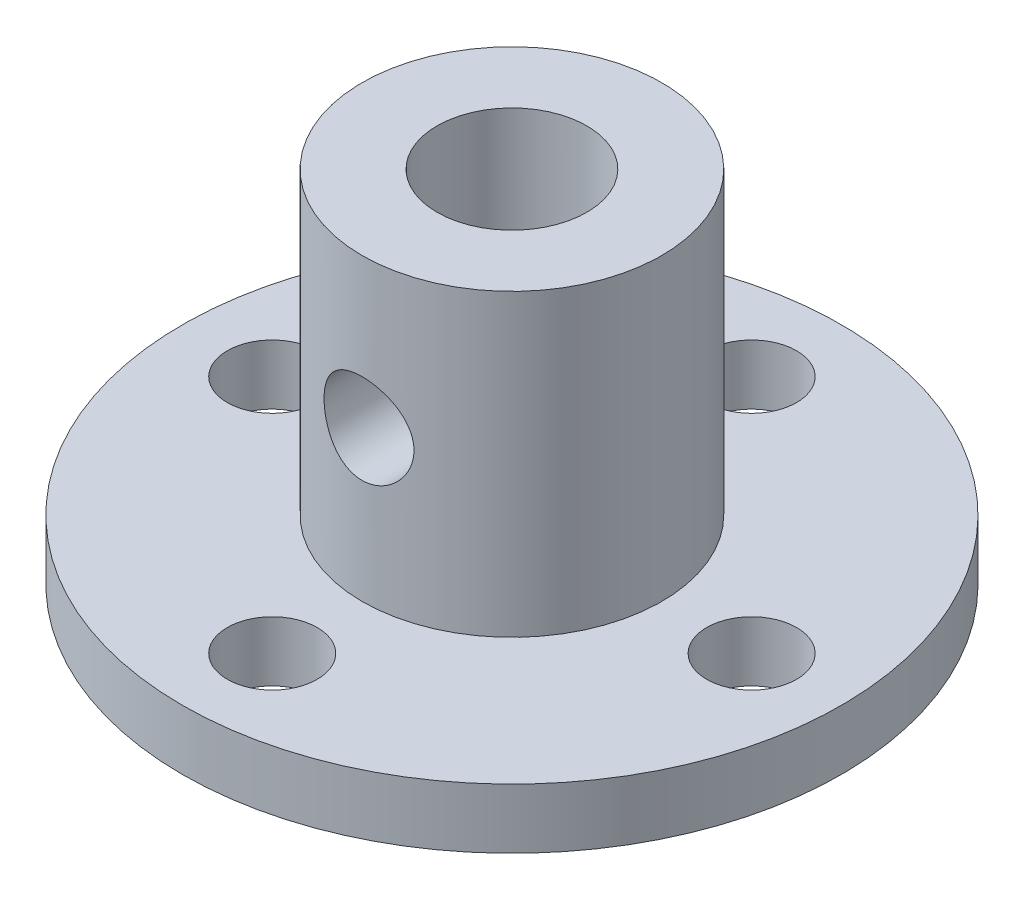
ISO-10303-21;
HEADER;
FILE_DESCRIPTION(('STEP AP214'),'2;1');
FILE_NAME('part.step','',(''),(''),'','','');
FILE_SCHEMA(('AUTOMOTIVE_DESIGN { 1 0 10303 214 1 1 1 1 }'));
ENDSEC;
DATA;
#1=APPLICATION_CONTEXT('core data for automotive mechanical design processes');
#2=APPLICATION_PROTOCOL_DEFINITION('international standard','automotive_design',2000,#1);
#3=PRODUCT_CONTEXT('',#1,'mechanical');
#4=PRODUCT('Part','Part','',(#3));
#5=PRODUCT_RELATED_PRODUCT_CATEGORY('part','',(#4));
#6=PRODUCT_DEFINITION_FORMATION('','',#4);
#7=PRODUCT_DEFINITION_CONTEXT('part definition',#1,'design');
#8=PRODUCT_DEFINITION('design','',#6,#7);
#9=PRODUCT_DEFINITION_SHAPE('','',#8);
#10=(LENGTH_UNIT() NAMED_UNIT(*) SI_UNIT(.MILLI.,.METRE.));
#11=(NAMED_UNIT(*) PLANE_ANGLE_UNIT() SI_UNIT($,.RADIAN.));
#12=(NAMED_UNIT(*) SI_UNIT($,.STERADIAN.) SOLID_ANGLE_UNIT());
#13=UNCERTAINTY_MEASURE_WITH_UNIT(LENGTH_MEASURE(1.E-05),#10,'distance_accuracy_value','');
#14=(GEOMETRIC_REPRESENTATION_CONTEXT(3) GLOBAL_UNCERTAINTY_ASSIGNED_CONTEXT((#13)) GLOBAL_UNIT_ASSIGNED_CONTEXT((#10,
#11,#12)) REPRESENTATION_CONTEXT('',''));
#15=CARTESIAN_POINT('',(0.,0.,0.));
#16=DIRECTION('',(0.,0.,1.));
#17=DIRECTION('',(1.,0.,0.));
#18=AXIS2_PLACEMENT_3D('',#15,#16,#17);
#19=CARTESIAN_POINT('',(0.,12.,0.));
#20=DIRECTION('',(0.,-1.,0.));
#21=DIRECTION('',(0.,0.,-1.));
#22=AXIS2_PLACEMENT_3D('',#19,#20,#21);
#23=CYLINDRICAL_SURFACE('',#22,5.);
#24=CARTESIAN_POINT('',(0.,12.,0.));
#25=DIRECTION('',(0.,1.,0.));
#26=DIRECTION('',(0.,0.,1.));
#27=AXIS2_PLACEMENT_3D('',#24,#25,#26);
#28=CIRCLE('',#27,5.);
#29=CARTESIAN_POINT('',(0.,12.,5.));
#30=VERTEX_POINT('',#29);
#31=EDGE_CURVE('E59',#30,#30,#28,.T.);
#32=ORIENTED_EDGE('',*,*,#31,.F.);
#33=EDGE_LOOP('',(#32));
#34=FACE_BOUND('',#33,.T.);
#35=CARTESIAN_POINT('',(0.,2.,0.));
#36=DIRECTION('',(0.,1.,0.));
#37=DIRECTION('',(0.,0.,1.));
#38=AXIS2_PLACEMENT_3D('',#35,#36,#37);
#39=CIRCLE('',#38,5.);
#40=CARTESIAN_POINT('',(0.,2.,5.));
#41=VERTEX_POINT('',#40);
#42=EDGE_CURVE('E10',#41,#41,#39,.T.);
#43=ORIENTED_EDGE('',*,*,#42,.T.);
#44=EDGE_LOOP('',(#43));
#45=FACE_BOUND('',#44,.T.);
#46=CARTESIAN_POINT('',(0.,8.5,-5.));
#47=CARTESIAN_POINT('',(0.0822886127532999,8.49999900251511,-4.9999992925055));
#48=CARTESIAN_POINT('',(0.164587318351529,8.49320613637603,-4.99794915693954));
#49=CARTESIAN_POINT('',(0.326788125304881,8.4662786457779,-4.98997105593691));
#50=CARTESIAN_POINT('',(0.40668950441142,8.44614004197666,-4.98404193389692));
#51=CARTESIAN_POINT('',(0.561732707754527,8.39325398308974,-4.96895552501836));
#52=CARTESIAN_POINT('',(0.636881364395373,8.36052513038107,-4.95980300250425));
#53=CARTESIAN_POINT('',(0.780624181053132,8.28346390694417,-4.93922109237645));
#54=CARTESIAN_POINT('',(0.84921746746967,8.23912999260458,-4.92779140192067));
#55=CARTESIAN_POINT('',(0.979871797183745,8.13877599252733,-4.90350737192774));
#56=CARTESIAN_POINT('',(1.04171807124434,8.08248337411409,-4.89062383657036));
#57=CARTESIAN_POINT('',(1.15524920923324,7.96039077008982,-4.86505834210442));
#58=CARTESIAN_POINT('',(1.20693236327441,7.89458918787504,-4.85237641724501));
#59=CARTESIAN_POINT('',(1.29980037723708,7.75352924696239,-4.82834113993772));
#60=CARTESIAN_POINT('',(1.34072309022213,7.67809153900926,-4.81702406663875));
#61=CARTESIAN_POINT('',(1.4092139477476,7.52101074576971,-4.79743620394031));
#62=CARTESIAN_POINT('',(1.43678529919973,7.43936915607202,-4.78916468313311));
#63=CARTESIAN_POINT('',(1.47701633682652,7.27460973386954,-4.77690870838434));
#64=CARTESIAN_POINT('',(1.49007196234677,7.19159725613606,-4.77281069324533));
#65=CARTESIAN_POINT('',(1.50213730614672,7.02446684378323,-4.76902789749767));
#66=CARTESIAN_POINT('',(1.50115042761078,6.94034918194091,-4.76934204760571));
#67=CARTESIAN_POINT('',(1.48546977199812,6.77661609139152,-4.77424744067778));
#68=CARTESIAN_POINT('',(1.47127205262685,6.69694774963776,-4.7786838859914));
#69=CARTESIAN_POINT('',(1.43037420427056,6.54118021372654,-4.79108356228624));
#70=CARTESIAN_POINT('',(1.40367284141641,6.46508137262567,-4.79904714132351));
#71=CARTESIAN_POINT('',(1.33816026653682,6.31739965033926,-4.81772733074973));
#72=CARTESIAN_POINT('',(1.29918816934642,6.24589291604474,-4.82848016115952));
#73=CARTESIAN_POINT('',(1.21035222588683,6.11026797798981,-4.85150987000065));
#74=CARTESIAN_POINT('',(1.16048574002588,6.04615157058622,-4.86378711746991));
#75=CARTESIAN_POINT('',(1.04881290765546,5.92431380923798,-4.88911011297937));
#76=CARTESIAN_POINT('',(0.986594907466972,5.86697133597033,-4.90216654310498));
#77=CARTESIAN_POINT('',(0.853263259313967,5.76344601593575,-4.92712244063259));
#78=CARTESIAN_POINT('',(0.782149051860888,5.71726387158557,-4.9390218351841));
#79=CARTESIAN_POINT('',(0.632355038342803,5.63714007753527,-4.9604316006947));
#80=CARTESIAN_POINT('',(0.55362774974795,5.60328248375014,-4.96992543668314));
#81=CARTESIAN_POINT('',(0.391245415603519,5.54940040990037,-4.98533521832222));
#82=CARTESIAN_POINT('',(0.307591751589581,5.52937207146751,-4.99125216186999));
#83=CARTESIAN_POINT('',(0.140952242668331,5.50434782210061,-4.99868364643538));
#84=CARTESIAN_POINT('',(0.0580500976011867,5.49883841419839,-5.0003485041779));
#85=CARTESIAN_POINT('',(-0.107499605823383,5.50156915571208,-4.9995292324176));
#86=CARTESIAN_POINT('',(-0.190147196690781,5.50980746965144,-4.99704565677756));
#87=CARTESIAN_POINT('',(-0.350903605309697,5.5393846111115,-4.98830696987163));
#88=CARTESIAN_POINT('',(-0.429072772614169,5.56042338758087,-4.98213829799417));
#89=CARTESIAN_POINT('',(-0.580754638954522,5.6146432327782,-4.96674347841533));
#90=CARTESIAN_POINT('',(-0.654266777025584,5.64782576103786,-4.95751696321085));
#91=CARTESIAN_POINT('',(-0.796437189461052,5.72625316548113,-4.93669654351325));
#92=CARTESIAN_POINT('',(-0.86494382619967,5.77175934094797,-4.92505280829675));
#93=CARTESIAN_POINT('',(-0.993523307980147,5.87322475405281,-4.90073468764318));
#94=CARTESIAN_POINT('',(-1.05359403235593,5.92918661188767,-4.8880600443108));
#95=CARTESIAN_POINT('',(-1.16585744551027,6.05238730836935,-4.86253171869138));
#96=CARTESIAN_POINT('',(-1.21768481231503,6.11996187577174,-4.84968825033268));
#97=CARTESIAN_POINT('',(-1.30928995072154,6.26312793901353,-4.82576515238463));
#98=CARTESIAN_POINT('',(-1.34906803829472,6.33871922455821,-4.81468547654651));
#99=CARTESIAN_POINT('',(-1.41517347127168,6.49553249125469,-4.79567189615055));
#100=CARTESIAN_POINT('',(-1.4415634693705,6.57672618653659,-4.78772337843827));
#101=CARTESIAN_POINT('',(-1.48021730815114,6.74268796893148,-4.77591594362794));
#102=CARTESIAN_POINT('',(-1.49248598978779,6.82745482078767,-4.772055625083));
#103=CARTESIAN_POINT('',(-1.50221984485059,6.99436151837623,-4.76899972496087));
#104=CARTESIAN_POINT('',(-1.5002805530849,7.07646365101759,-4.76961647442754));
#105=CARTESIAN_POINT('',(-1.48307505444813,7.2391141033728,-4.77499401288294));
#106=CARTESIAN_POINT('',(-1.46780938124716,7.31966248517635,-4.77975463592551));
#107=CARTESIAN_POINT('',(-1.42476888804136,7.47594539914285,-4.79275763670386));
#108=CARTESIAN_POINT('',(-1.39715175507068,7.55172728736169,-4.80095604545965));
#109=CARTESIAN_POINT('',(-1.33031507121129,7.69764243881772,-4.81990278909136));
#110=CARTESIAN_POINT('',(-1.29109329962876,7.76777461764076,-4.83065161194312));
#111=CARTESIAN_POINT('',(-1.20048763805072,7.90316311652711,-4.85397676425833));
#112=CARTESIAN_POINT('',(-1.14871276092994,7.96814876126041,-4.86660540163798));
#113=CARTESIAN_POINT('',(-1.03517434629782,8.08870249830787,-4.89201320450026));
#114=CARTESIAN_POINT('',(-0.9734082171345,8.14426813946776,-4.90479240823905));
#115=CARTESIAN_POINT('',(-0.839465762183248,8.24602341229503,-4.92950936570649));
#116=CARTESIAN_POINT('',(-0.767037885790608,8.29189144685549,-4.94141159765674));
#117=CARTESIAN_POINT('',(-0.61514137398353,8.37073516990402,-4.96260680455813));
#118=CARTESIAN_POINT('',(-0.535676052998955,8.40371688827451,-4.97190099931067));
#119=CARTESIAN_POINT('',(-0.380757712655281,8.45289527565275,-4.98602174969301));
#120=CARTESIAN_POINT('',(-0.305786961954234,8.47051167288325,-4.99122027381068));
#121=CARTESIAN_POINT('',(-0.15388019523078,8.49406352524158,-4.99820944494492));
#122=CARTESIAN_POINT('',(-0.0769445098581397,8.50000093270482,-5.0000006615474));
#123=CARTESIAN_POINT('',(0.,8.5,-5.));
#124=B_SPLINE_CURVE_WITH_KNOTS('',3,(#46,#47,#48,#49,#50,#51,#52,#53,#54,#55,#56,#57,#58,#59,
#60,#61,#62,#63,#64,#65,#66,#67,#68,#69,#70,#71,#72,#73,#74,#75,#76,#77,#78,#79,#80,#81,#82,#83,
#84,#85,#86,#87,#88,#89,#90,#91,#92,#93,#94,#95,#96,#97,#98,#99,#100,#101,#102,#103,#104,#105,
#106,#107,#108,#109,#110,#111,#112,#113,#114,#115,#116,#117,#118,#119,#120,#121,#122,#123),
.UNSPECIFIED.,.T.,.F.,(4,2,2,2,2,2,2,2,2,2,2,2,2,2,2,2,2,2,2,2,2,2,2,2,2,2,2,2,2,2,2,2,2,2,2,2,
2,2,4),(0.,0.24658320361261,0.493239964846,0.739533676300875,0.985860164412702,1.23855602948191,
1.49129437288633,1.74971481004109,2.00807314543224,2.25919689356599,2.51025978319089,
2.75226016697676,2.99428443658001,3.2396242644712,3.48502360158555,3.74067104048167,
3.99633456531072,4.25371046881689,4.51101453528808,4.75908809438545,5.00712853550327,
5.24956746682327,5.49203554593729,5.74011305702908,5.98825282000191,6.24540400322819,
6.50254844252681,6.75847814951252,7.01432009460283,7.25950155466943,7.504673196616,
7.74680040402721,7.98897397553107,8.23996925679931,8.49102974897502,8.74942996156671,
9.00770911595235,9.2383169193046,9.46888616948875),.UNSPECIFIED.);
#125=CARTESIAN_POINT('',(0.,8.5,-5.));
#126=VERTEX_POINT('',#125);
#127=EDGE_CURVE('E111',#126,#126,#124,.T.);
#128=ORIENTED_EDGE('',*,*,#127,.F.);
#129=EDGE_LOOP('',(#128));
#130=FACE_BOUND('',#129,.T.);
#131=CARTESIAN_POINT('',(0.,5.5,5.));
#132=CARTESIAN_POINT('',(0.0822886127532999,5.50000099748489,4.9999992925055));
#133=CARTESIAN_POINT('',(0.164587318351529,5.50679386362397,4.99794915693954));
#134=CARTESIAN_POINT('',(0.326788125304881,5.5337213542221,4.98997105593691));
#135=CARTESIAN_POINT('',(0.40668950441142,5.55385995802334,4.98404193389692));
#136=CARTESIAN_POINT('',(0.561732707754527,5.60674601691026,4.96895552501836));
#137=CARTESIAN_POINT('',(0.636881364395373,5.63947486961894,4.95980300250425));
#138=CARTESIAN_POINT('',(0.780624181053131,5.71653609305584,4.93922109237645));
#139=CARTESIAN_POINT('',(0.849217467469669,5.76087000739542,4.92779140192067));
#140=CARTESIAN_POINT('',(0.979871797183745,5.86122400747267,4.90350737192774));
#141=CARTESIAN_POINT('',(1.04171807124434,5.91751662588591,4.89062383657036));
#142=CARTESIAN_POINT('',(1.15524920923324,6.03960922991018,4.86505834210442));
#143=CARTESIAN_POINT('',(1.20693236327441,6.10541081212496,4.85237641724501));
#144=CARTESIAN_POINT('',(1.29980037723708,6.24647075303761,4.82834113993772));
#145=CARTESIAN_POINT('',(1.34072309022213,6.32190846099074,4.81702406663875));
#146=CARTESIAN_POINT('',(1.4092139477476,6.47898925423029,4.79743620394031));
#147=CARTESIAN_POINT('',(1.43678529919973,6.56063084392798,4.78916468313311));
#148=CARTESIAN_POINT('',(1.47701633682652,6.72539026613046,4.77690870838434));
#149=CARTESIAN_POINT('',(1.49007196234677,6.80840274386394,4.77281069324533));
#150=CARTESIAN_POINT('',(1.50213730614672,6.97553315621677,4.76902789749767));
#151=CARTESIAN_POINT('',(1.50115042761078,7.05965081805909,4.76934204760571));
#152=CARTESIAN_POINT('',(1.48546977199812,7.22338390860848,4.77424744067778));
#153=CARTESIAN_POINT('',(1.47127205262685,7.30305225036224,4.7786838859914));
#154=CARTESIAN_POINT('',(1.43037420427056,7.45881978627346,4.79108356228624));
#155=CARTESIAN_POINT('',(1.40367284141641,7.53491862737433,4.79904714132351));
#156=CARTESIAN_POINT('',(1.33816026653682,7.68260034966074,4.81772733074973));
#157=CARTESIAN_POINT('',(1.29918816934642,7.75410708395526,4.82848016115952));
#158=CARTESIAN_POINT('',(1.21035222588683,7.88973202201019,4.85150987000065));
#159=CARTESIAN_POINT('',(1.16048574002588,7.95384842941378,4.86378711746991));
#160=CARTESIAN_POINT('',(1.04881290765546,8.07568619076202,4.88911011297937));
#161=CARTESIAN_POINT('',(0.986594907466972,8.13302866402967,4.90216654310498));
#162=CARTESIAN_POINT('',(0.853263259313967,8.23655398406425,4.92712244063259));
#163=CARTESIAN_POINT('',(0.782149051860888,8.28273612841443,4.9390218351841));
#164=CARTESIAN_POINT('',(0.632355038342803,8.36285992246473,4.9604316006947));
#165=CARTESIAN_POINT('',(0.55362774974795,8.39671751624986,4.96992543668314));
#166=CARTESIAN_POINT('',(0.391245415603519,8.45059959009963,4.98533521832222));
#167=CARTESIAN_POINT('',(0.307591751589581,8.47062792853249,4.99125216186999));
#168=CARTESIAN_POINT('',(0.140952242668331,8.49565217789939,4.99868364643538));
#169=CARTESIAN_POINT('',(0.0580500976011867,8.50116158580161,5.0003485041779));
#170=CARTESIAN_POINT('',(-0.107499605823383,8.49843084428792,4.9995292324176));
#171=CARTESIAN_POINT('',(-0.190147196690781,8.49019253034856,4.99704565677756));
#172=CARTESIAN_POINT('',(-0.350903605309697,8.4606153888885,4.98830696987163));
#173=CARTESIAN_POINT('',(-0.429072772614169,8.43957661241913,4.98213829799417));
#174=CARTESIAN_POINT('',(-0.580754638954522,8.3853567672218,4.96674347841533));
#175=CARTESIAN_POINT('',(-0.654266777025583,8.35217423896214,4.95751696321085));
#176=CARTESIAN_POINT('',(-0.796437189461052,8.27374683451887,4.93669654351325));
#177=CARTESIAN_POINT('',(-0.86494382619967,8.22824065905203,4.92505280829675));
#178=CARTESIAN_POINT('',(-0.993523307980147,8.12677524594719,4.90073468764318));
#179=CARTESIAN_POINT('',(-1.05359403235593,8.07081338811233,4.8880600443108));
#180=CARTESIAN_POINT('',(-1.16585744551027,7.94761269163066,4.86253171869138));
#181=CARTESIAN_POINT('',(-1.21768481231504,7.88003812422826,4.84968825033268));
#182=CARTESIAN_POINT('',(-1.30928995072154,7.73687206098647,4.82576515238463));
#183=CARTESIAN_POINT('',(-1.34906803829472,7.66128077544179,4.81468547654651));
#184=CARTESIAN_POINT('',(-1.41517347127168,7.50446750874531,4.79567189615055));
#185=CARTESIAN_POINT('',(-1.4415634693705,7.42327381346341,4.78772337843827));
#186=CARTESIAN_POINT('',(-1.48021730815114,7.25731203106852,4.77591594362794));
#187=CARTESIAN_POINT('',(-1.49248598978779,7.17254517921233,4.772055625083));
#188=CARTESIAN_POINT('',(-1.50221984485059,7.00563848162377,4.76899972496087));
#189=CARTESIAN_POINT('',(-1.5002805530849,6.92353634898241,4.76961647442754));
#190=CARTESIAN_POINT('',(-1.48307505444813,6.7608858966272,4.77499401288294));
#191=CARTESIAN_POINT('',(-1.46780938124716,6.68033751482365,4.77975463592551));
#192=CARTESIAN_POINT('',(-1.42476888804136,6.52405460085715,4.79275763670386));
#193=CARTESIAN_POINT('',(-1.39715175507068,6.44827271263831,4.80095604545965));
#194=CARTESIAN_POINT('',(-1.33031507121129,6.30235756118228,4.81990278909136));
#195=CARTESIAN_POINT('',(-1.29109329962876,6.23222538235924,4.83065161194312));
#196=CARTESIAN_POINT('',(-1.20048763805072,6.09683688347289,4.85397676425833));
#197=CARTESIAN_POINT('',(-1.14871276092994,6.03185123873959,4.86660540163798));
#198=CARTESIAN_POINT('',(-1.03517434629782,5.91129750169214,4.89201320450026));
#199=CARTESIAN_POINT('',(-0.973408217134501,5.85573186053224,4.90479240823905));
#200=CARTESIAN_POINT('',(-0.839465762183248,5.75397658770497,4.92950936570649));
#201=CARTESIAN_POINT('',(-0.767037885790608,5.70810855314451,4.94141159765674));
#202=CARTESIAN_POINT('',(-0.615141373983529,5.62926483009598,4.96260680455813));
#203=CARTESIAN_POINT('',(-0.535676052998955,5.59628311172549,4.97190099931067));
#204=CARTESIAN_POINT('',(-0.380757712655281,5.54710472434725,4.98602174969301));
#205=CARTESIAN_POINT('',(-0.305786961954234,5.52948832711675,4.99122027381068));
#206=CARTESIAN_POINT('',(-0.153880195230779,5.50593647475842,4.99820944494492));
#207=CARTESIAN_POINT('',(-0.0769445098581396,5.49999906729518,5.0000006615474));
#208=CARTESIAN_POINT('',(0.,5.5,5.));
#209=B_SPLINE_CURVE_WITH_KNOTS('',3,(#131,#132,#133,#134,#135,#136,#137,#138,#139,#140,#141,
#142,#143,#144,#145,#146,#147,#148,#149,#150,#151,#152,#153,#154,#155,#156,#157,#158,#159,#160,
#161,#162,#163,#164,#165,#166,#167,#168,#169,#170,#171,#172,#173,#174,#175,#176,#177,#178,#179,
#180,#181,#182,#183,#184,#185,#186,#187,#188,#189,#190,#191,#192,#193,#194,#195,#196,#197,#198,
#199,#200,#201,#202,#203,#204,#205,#206,#207,#208),.UNSPECIFIED.,.T.,.F.,(4,2,2,2,2,2,2,2,2,2,2,
2,2,2,2,2,2,2,2,2,2,2,2,2,2,2,2,2,2,2,2,2,2,2,2,2,2,2,4),(0.,0.24658320361261,0.493239964845999,
0.739533676300874,0.985860164412702,1.23855602948191,1.49129437288633,1.74971481004109,
2.00807314543224,2.25919689356599,2.51025978319089,2.75226016697676,2.99428443658001,
3.2396242644712,3.48502360158555,3.74067104048167,3.99633456531071,4.25371046881689,
4.51101453528808,4.75908809438545,5.00712853550327,5.24956746682327,5.49203554593729,
5.74011305702908,5.98825282000191,6.24540400322818,6.5025484425268,6.75847814951252,
7.01432009460283,7.25950155466943,7.504673196616,7.74680040402721,7.98897397553107,
8.23996925679931,8.49102974897502,8.74942996156671,9.00770911595235,9.23831691930459,
9.46888616948874),.UNSPECIFIED.);
#210=CARTESIAN_POINT('',(0.,5.5,5.));
#211=VERTEX_POINT('',#210);
#212=EDGE_CURVE('E105',#211,#211,#209,.T.);
#213=ORIENTED_EDGE('',*,*,#212,.F.);
#214=EDGE_LOOP('',(#213));
#215=FACE_BOUND('',#214,.T.);
#216=ADVANCED_FACE('F37',(#34,#45,#130,#215),#23,.T.);
#217=CARTESIAN_POINT('',(0.,0.,0.));
#218=DIRECTION('',(0.,1.,0.));
#219=DIRECTION('',(0.,0.,1.));
#220=AXIS2_PLACEMENT_3D('',#217,#218,#219);
#221=CYLINDRICAL_SURFACE('',#220,2.5);
#222=CARTESIAN_POINT('',(0.,0.,0.));
#223=DIRECTION('',(0.,1.,0.));
#224=DIRECTION('',(0.,0.,1.));
#225=AXIS2_PLACEMENT_3D('',#222,#223,#224);
#226=CIRCLE('',#225,2.5);
#227=CARTESIAN_POINT('',(0.,0.,2.5));
#228=VERTEX_POINT('',#227);
#229=EDGE_CURVE('E148',#228,#228,#226,.T.);
#230=ORIENTED_EDGE('',*,*,#229,.F.);
#231=EDGE_LOOP('',(#230));
#232=FACE_BOUND('',#231,.T.);
#233=CARTESIAN_POINT('',(0.,12.,0.));
#234=DIRECTION('',(0.,1.,0.));
#235=DIRECTION('',(0.,0.,1.));
#236=AXIS2_PLACEMENT_3D('',#233,#234,#235);
#237=CIRCLE('',#236,2.5);
#238=CARTESIAN_POINT('',(0.,12.,2.5));
#239=VERTEX_POINT('',#238);
#240=EDGE_CURVE('E173',#239,#239,#237,.T.);
#241=ORIENTED_EDGE('',*,*,#240,.T.);
#242=EDGE_LOOP('',(#241));
#243=FACE_BOUND('',#242,.T.);
#244=CARTESIAN_POINT('',(-1.5,7.,-2.));
#245=CARTESIAN_POINT('',(-1.50000404108592,6.92452102471036,-1.99999416642511));
#246=CARTESIAN_POINT('',(-1.49426852824013,6.8490615659202,-2.00433633903481));
#247=CARTESIAN_POINT('',(-1.47174965152787,6.70067609603778,-2.02092590613883));
#248=CARTESIAN_POINT('',(-1.45495475788936,6.6277528126149,-2.03318155043097));
#249=CARTESIAN_POINT('',(-1.41143486335795,6.48691635832272,-2.0636233903473));
#250=CARTESIAN_POINT('',(-1.3847815450315,6.41897116196473,-2.0817666618312));
#251=CARTESIAN_POINT('',(-1.32252909283019,6.28856254663208,-2.12185904995836));
#252=CARTESIAN_POINT('',(-1.28692729054693,6.22610077030486,-2.14380930122416));
#253=CARTESIAN_POINT('',(-1.20271292747644,6.10005098333592,-2.19228594587542));
#254=CARTESIAN_POINT('',(-1.15304179435289,6.03725904287606,-2.21904371037662));
#255=CARTESIAN_POINT('',(-1.04426801309985,5.92023523725825,-2.27226229431061));
#256=CARTESIAN_POINT('',(-0.985158296729613,5.8660098483292,-2.29872287517103));
#257=CARTESIAN_POINT('',(-0.851442367411702,5.76186619029031,-2.35175567858734));
#258=CARTESIAN_POINT('',(-0.775851995162548,5.71304553633025,-2.37803133577818));
#259=CARTESIAN_POINT('',(-0.615654228271658,5.62919027755557,-2.42443786983179));
#260=CARTESIAN_POINT('',(-0.531055196626331,5.59414302587729,-2.44457437988735));
#261=CARTESIAN_POINT('',(-0.363771406742667,5.54240407718735,-2.4747098780044));
#262=CARTESIAN_POINT('',(-0.281674698130915,5.5242796390327,-2.4854930393917));
#263=CARTESIAN_POINT('',(-0.114970509382709,5.50205719713688,-2.49874939277545));
#264=CARTESIAN_POINT('',(-0.0303654624001538,5.49794602199995,-2.50123038813307));
#265=CARTESIAN_POINT('',(0.127637283737309,5.50361374734246,-2.49783372711539));
#266=CARTESIAN_POINT('',(0.201123832865634,5.51173352616931,-2.49295437513726));
#267=CARTESIAN_POINT('',(0.345464269151767,5.53847979564811,-2.47707997553857));
#268=CARTESIAN_POINT('',(0.416317961051201,5.55710706390716,-2.46608447529309));
#269=CARTESIAN_POINT('',(0.554056780469079,5.60416556270378,-2.43884907201719));
#270=CARTESIAN_POINT('',(0.620916491037617,5.632653061139,-2.42257910450824));
#271=CARTESIAN_POINT('',(0.74898866011561,5.69838461622554,-2.38609637638748));
#272=CARTESIAN_POINT('',(0.81019964620801,5.73563094705901,-2.36588259201812));
#273=CARTESIAN_POINT('',(0.933074267143199,5.82283909280445,-2.32037925976363));
#274=CARTESIAN_POINT('',(0.993918663198192,5.87378831173574,-2.2947718295215));
#275=CARTESIAN_POINT('',(1.10671465909274,5.98440411786018,-2.24255554245601));
#276=CARTESIAN_POINT('',(1.1586540130834,6.04408250347451,-2.21594536703375));
#277=CARTESIAN_POINT('',(1.25824837767417,6.17865340616355,-2.16111075123946));
#278=CARTESIAN_POINT('',(1.30470933188632,6.25450757653946,-2.13305661385124));
#279=CARTESIAN_POINT('',(1.38397217194232,6.41470623163661,-2.08250879557267));
#280=CARTESIAN_POINT('',(1.41679921962189,6.49903471612564,-2.0600049029882));
#281=CARTESIAN_POINT('',(1.46077497064842,6.65239363189535,-2.02895865196731));
#282=CARTESIAN_POINT('',(1.47527903312665,6.72004063229664,-2.01833888618316));
#283=CARTESIAN_POINT('',(1.49480872755284,6.85737361029948,-2.00392150777558));
#284=CARTESIAN_POINT('',(1.49984538302907,6.92705712048456,-2.00011596115116));
#285=CARTESIAN_POINT('',(1.50014781114183,7.0665516824357,-1.99988914321323));
#286=CARTESIAN_POINT('',(1.49540004697659,7.13636277721521,-2.00347810223984));
#287=CARTESIAN_POINT('',(1.47640290574941,7.27398734374856,-2.01751520788652));
#288=CARTESIAN_POINT('',(1.46214601830139,7.34179919224025,-2.02796877613213));
#289=CARTESIAN_POINT('',(1.42488312618657,7.47371457947978,-2.054317683331));
#290=CARTESIAN_POINT('',(1.40188805257362,7.53782263653223,-2.07020622092812));
#291=CARTESIAN_POINT('',(1.34796261057072,7.66147771573018,-2.10571539417587));
#292=CARTESIAN_POINT('',(1.31702924888212,7.721023006366,-2.12533743689999));
#293=CARTESIAN_POINT('',(1.24167439558512,7.84524008251225,-2.17036819177736));
#294=CARTESIAN_POINT('',(1.19582663060303,7.90890083509657,-2.19618239397369));
#295=CARTESIAN_POINT('',(1.09487395518701,8.02828548484946,-2.2482175480362));
#296=CARTESIAN_POINT('',(1.03976018672402,8.08400169216912,-2.27443886711455));
#297=CARTESIAN_POINT('',(0.913274837212769,8.19322400735043,-2.32835625910913));
#298=CARTESIAN_POINT('',(0.840721108780194,8.24550072660583,-2.3558007587587));
#299=CARTESIAN_POINT('',(0.686103100868023,8.33690277683665,-2.40537639133459));
#300=CARTESIAN_POINT('',(0.604045176134706,8.37603682784092,-2.4275110444941));
#301=CARTESIAN_POINT('',(0.438840232972142,8.43686820343137,-2.46252280092775));
#302=CARTESIAN_POINT('',(0.356205963651262,8.45962622779111,-2.47595588067329));
#303=CARTESIAN_POINT('',(0.187383063890861,8.49071460284626,-2.494407389061));
#304=CARTESIAN_POINT('',(0.101198571781973,8.49906129071762,-2.49943534582737));
#305=CARTESIAN_POINT('',(-0.0598120232009797,8.50067460858593,-2.50040600461976));
#306=CARTESIAN_POINT('',(-0.134620583589702,8.49580333456303,-2.49747057186327));
#307=CARTESIAN_POINT('',(-0.28214875597877,8.47510617561839,-2.48512948412096));
#308=CARTESIAN_POINT('',(-0.354868344701911,8.4592801686784,-2.47572375706639));
#309=CARTESIAN_POINT('',(-0.495145481978794,8.41778042841622,-2.45149427526962));
#310=CARTESIAN_POINT('',(-0.562767032608827,8.39226840387076,-2.43675966858906));
#311=CARTESIAN_POINT('',(-0.692781971999981,8.33235940544525,-2.40303337447155));
#312=CARTESIAN_POINT('',(-0.75517418419983,8.2979604391404,-2.38404073252268));
#313=CARTESIAN_POINT('',(-0.880263645295945,8.21707480343125,-2.34093432659381));
#314=CARTESIAN_POINT('',(-0.942258690439937,8.16968129098314,-2.31648844639149));
#315=CARTESIAN_POINT('',(-1.05789751536306,8.06624696628228,-2.26601907350661));
#316=CARTESIAN_POINT('',(-1.11153190956915,8.0101965743921,-2.23999385274509));
#317=CARTESIAN_POINT('',(-1.2159097535057,7.88271443782231,-2.18528165666205));
#318=CARTESIAN_POINT('',(-1.26542406663367,7.8102335138345,-2.15667566270901));
#319=CARTESIAN_POINT('',(-1.35156817210325,7.65651514723346,-2.10376464485145));
#320=CARTESIAN_POINT('',(-1.38820466322661,7.57528228601859,-2.07945738811052));
#321=CARTESIAN_POINT('',(-1.44437116535132,7.4129357148628,-2.0408000304796));
#322=CARTESIAN_POINT('',(-1.46509526060187,7.33240476403876,-2.02577665830138));
#323=CARTESIAN_POINT('',(-1.49289268240426,7.16790260529632,-2.00539032320036));
#324=CARTESIAN_POINT('',(-1.49999550595837,7.08393923424129,-2.00000648744643));
#325=CARTESIAN_POINT('',(-1.5,7.,-2.));
#326=B_SPLINE_CURVE_WITH_KNOTS('',3,(#244,#245,#246,#247,#248,#249,#250,#251,#252,#253,#254,
#255,#256,#257,#258,#259,#260,#261,#262,#263,#264,#265,#266,#267,#268,#269,#270,#271,#272,#273,
#274,#275,#276,#277,#278,#279,#280,#281,#282,#283,#284,#285,#286,#287,#288,#289,#290,#291,#292,
#293,#294,#295,#296,#297,#298,#299,#300,#301,#302,#303,#304,#305,#306,#307,#308,#309,#310,#311,
#312,#313,#314,#315,#316,#317,#318,#319,#320,#321,#322,#323,#324,#325),.UNSPECIFIED.,.T.,.F.,(4,
2,2,2,2,2,2,2,2,2,2,2,2,2,2,2,2,2,2,2,2,2,2,2,2,2,2,2,2,2,2,2,2,2,2,2,2,2,2,2,4),(0.,
0.226085249493393,0.45240657433077,0.677113624991875,0.901887762215932,1.15414462390001,
1.40659128601844,1.68630157736223,1.9657544327122,2.21853330858497,2.47107452602766,
2.69230130543181,2.91354445887944,3.13607155036376,3.35865648368878,3.60782810055849,
3.85733966656908,4.13576671140276,4.41367760154768,4.62276298054684,4.83160475643976,
5.04073566011181,5.25003193304128,5.45906724365495,5.6681814915466,5.91499438482002,
6.16204457978454,6.44121828011588,6.72020638384847,6.97891479383337,7.23732973022726,
7.46129321849399,7.68525920139648,7.90563970188756,8.12606965394584,8.37042963549487,
8.61506198741955,8.89071695766604,9.16622832484805,9.41820120134354,9.66962780912277),.UNSPECIFIED.);
#327=CARTESIAN_POINT('',(-1.5,7.,-2.));
#328=VERTEX_POINT('',#327);
#329=EDGE_CURVE('E86',#328,#328,#326,.T.);
#330=ORIENTED_EDGE('',*,*,#329,.F.);
#331=EDGE_LOOP('',(#330));
#332=FACE_BOUND('',#331,.T.);
#333=CARTESIAN_POINT('',(0.,5.5,2.5));
#334=CARTESIAN_POINT('',(-0.0767298334620158,5.50000409100988,2.49999625789732));
#335=CARTESIAN_POINT('',(-0.153582320644178,5.50592867092626,2.4964290461501));
#336=CARTESIAN_POINT('',(-0.304975509530679,5.52932431951533,2.48249903608568));
#337=CARTESIAN_POINT('',(-0.379510034596047,5.54682386185422,2.47211948032719));
#338=CARTESIAN_POINT('',(-0.523751827790837,5.59238636116686,2.44561558054488));
#339=CARTESIAN_POINT('',(-0.593481028226566,5.62039695816316,2.42951973272944));
#340=CARTESIAN_POINT('',(-0.727030318214659,5.68586033314103,2.39295367626407));
#341=CARTESIAN_POINT('',(-0.790851869416383,5.72331076696875,2.37248455380255));
#342=CARTESIAN_POINT('',(-0.916299278999315,5.80977482670858,2.32705360719088));
#343=CARTESIAN_POINT('',(-0.977384020081415,5.85945369535139,2.30186792195985));
#344=CARTESIAN_POINT('',(-1.09088270411891,5.96746720382827,2.25030439279634));
#345=CARTESIAN_POINT('',(-1.14328534948112,6.02581293718732,2.22392505153571));
#346=CARTESIAN_POINT('',(-1.24444996762974,6.15792351049673,2.1691106699591));
#347=CARTESIAN_POINT('',(-1.29197766378809,6.23270177098129,2.14082017703649));
#348=CARTESIAN_POINT('',(-1.37361437764896,6.39084657324311,2.08938301412124));
#349=CARTESIAN_POINT('',(-1.4077451733516,6.47419889624757,2.06622802273938));
#350=CARTESIAN_POINT('',(-1.45440601714222,6.62659645065324,2.0335462966093));
#351=CARTESIAN_POINT('',(-1.47016197246826,6.69423599861032,2.02207883137591));
#352=CARTESIAN_POINT('',(-1.49216172340475,6.83180371583036,2.00590308295503));
#353=CARTESIAN_POINT('',(-1.49841734556836,6.90172892875449,2.00118639643759));
#354=CARTESIAN_POINT('',(-1.50105508796009,7.04201149421734,1.99920922463856));
#355=CARTESIAN_POINT('',(-1.49741783408419,7.1123694250932,2.00196337012718));
#356=CARTESIAN_POINT('',(-1.48046060478828,7.25127877542759,2.01453261443741));
#357=CARTESIAN_POINT('',(-1.46713334620103,7.31982879584745,2.02435302432226));
#358=CARTESIAN_POINT('',(-1.43173921881792,7.45253024212811,2.04953186944258));
#359=CARTESIAN_POINT('',(-1.40978748666087,7.51672705392448,2.06481711652537));
#360=CARTESIAN_POINT('',(-1.35795061770837,7.64069499092812,2.09927051350828));
#361=CARTESIAN_POINT('',(-1.32806257259705,7.70046448342393,2.11844008623465));
#362=CARTESIAN_POINT('',(-1.25517983184583,7.8249840971228,2.16255327268985));
#363=CARTESIAN_POINT('',(-1.21080724397723,7.88877809295493,2.18792043372992));
#364=CARTESIAN_POINT('',(-1.11291092784003,8.00867648366702,2.23930599764381));
#365=CARTESIAN_POINT('',(-1.05937845100579,8.06477343397651,2.26532500262149));
#366=CARTESIAN_POINT('',(-0.935811834382966,8.17561298182176,2.31935504958317));
#367=CARTESIAN_POINT('',(-0.864517682704956,8.22907730601599,2.34713836268532));
#368=CARTESIAN_POINT('',(-0.712276050458999,8.32312204719791,2.39772428433981));
#369=CARTESIAN_POINT('',(-0.631333763943564,8.36370935378995,2.42052955425515));
#370=CARTESIAN_POINT('',(-0.467197585268206,8.4279321827959,2.45730392066151));
#371=CARTESIAN_POINT('',(-0.38446762417358,8.45247535571592,2.47173957439704));
#372=CARTESIAN_POINT('',(-0.215047895144639,8.48701119740538,2.49218842813551));
#373=CARTESIAN_POINT('',(-0.128363005661319,8.49702131775358,2.49821172952738));
#374=CARTESIAN_POINT('',(0.0337146143773967,8.50150784767831,2.5009057037461));
#375=CARTESIAN_POINT('',(0.109042473418718,8.49790885508517,2.49873521714286));
#376=CARTESIAN_POINT('',(0.25782940198606,8.47957414692808,2.48778712087048));
#377=CARTESIAN_POINT('',(0.331288509376105,8.46483865719419,2.47900964518037));
#378=CARTESIAN_POINT('',(0.472574932157613,8.42545656718754,2.4559479244219));
#379=CARTESIAN_POINT('',(0.540495750928484,8.40105965092653,2.44180275662555));
#380=CARTESIAN_POINT('',(0.671265749087263,8.34332262363473,2.40913880862844));
#381=CARTESIAN_POINT('',(0.734113924963908,8.30998074865333,2.39061916586511));
#382=CARTESIAN_POINT('',(0.860006262823863,8.23144302079129,2.3484549623736));
#383=CARTESIAN_POINT('',(0.922394150456837,8.18537617092161,2.3244780273988));
#384=CARTESIAN_POINT('',(1.03902603131014,8.08460860651138,2.27474265574731));
#385=CARTESIAN_POINT('',(1.09326040273738,8.02989784514746,2.2489821658636));
#386=CARTESIAN_POINT('',(1.19931996735579,7.90508960996285,2.19445423909891));
#387=CARTESIAN_POINT('',(1.24991019630915,7.8339161145345,2.16573241746291));
#388=CARTESIAN_POINT('',(1.33845238915668,7.6827839754318,2.1121618206671));
#389=CARTESIAN_POINT('',(1.37641766769781,7.60283470610721,2.0873089799769));
#390=CARTESIAN_POINT('',(1.43142578795776,7.45375697769331,2.04984909240519));
#391=CARTESIAN_POINT('',(1.4512162533619,7.38601968764141,2.03575659328729));
#392=CARTESIAN_POINT('',(1.48113663905972,7.2474679219199,2.01409605743544));
#393=CARTESIAN_POINT('',(1.49127995297631,7.17665785567217,2.00651897642721));
#394=CARTESIAN_POINT('',(1.50134130416631,7.03362305240297,1.99900446616268));
#395=CARTESIAN_POINT('',(1.50122089107869,6.96139400931296,1.99909576445937));
#396=CARTESIAN_POINT('',(1.49066472959328,6.81810556439054,2.0069771789285));
#397=CARTESIAN_POINT('',(1.48022337215759,6.74704681991941,2.0147714813882));
#398=CARTESIAN_POINT('',(1.45040174148913,6.61151158242781,2.0363318524298));
#399=CARTESIAN_POINT('',(1.43147636845351,6.54688290569313,2.0497921180558));
#400=CARTESIAN_POINT('',(1.38563242076993,6.42166274552578,2.08105501960151));
#401=CARTESIAN_POINT('',(1.35871083588479,6.36107279303945,2.09885929040482));
#402=CARTESIAN_POINT('',(1.29289245555733,6.23568014277922,2.14012990550917));
#403=CARTESIAN_POINT('',(1.25279167675753,6.17165889614569,2.16404587582639));
#404=CARTESIAN_POINT('',(1.16375698389085,6.05061992738271,2.21320127030768));
#405=CARTESIAN_POINT('',(1.11481579607798,5.99360803784744,2.23844177205021));
#406=CARTESIAN_POINT('',(1.00009777425734,5.87864905086833,2.29225690291476));
#407=CARTESIAN_POINT('',(0.932876819313906,5.82206892510381,2.32070308663658));
#408=CARTESIAN_POINT('',(0.788462434445591,5.7209021441367,2.37365428872367));
#409=CARTESIAN_POINT('',(0.711265444501542,5.67631978801521,2.39815789310936));
#410=CARTESIAN_POINT('',(0.551125230801456,5.60221419242626,2.43985578654394));
#411=CARTESIAN_POINT('',(0.468430086957216,5.57227193507317,2.45725077479787));
#412=CARTESIAN_POINT('',(0.29797330611881,5.52727530478902,2.48366273001246));
#413=CARTESIAN_POINT('',(0.210232099648614,5.51216483214301,2.49271125871485));
#414=CARTESIAN_POINT('',(0.101558096917538,5.50330254529134,2.49802001168187));
#415=CARTESIAN_POINT('',(0.0812762590282795,5.5020655826939,2.49876114656362));
#416=CARTESIAN_POINT('',(0.0406658206871136,5.50041375362914,2.49975164517367));
#417=CARTESIAN_POINT('',(0.0203372186375701,5.4999989156791,2.50000099184316));
#418=CARTESIAN_POINT('',(0.,5.5,2.5));
#419=B_SPLINE_CURVE_WITH_KNOTS('',3,(#333,#334,#335,#336,#337,#338,#339,#340,#341,#342,#343,
#344,#345,#346,#347,#348,#349,#350,#351,#352,#353,#354,#355,#356,#357,#358,#359,#360,#361,#362,
#363,#364,#365,#366,#367,#368,#369,#370,#371,#372,#373,#374,#375,#376,#377,#378,#379,#380,#381,
#382,#383,#384,#385,#386,#387,#388,#389,#390,#391,#392,#393,#394,#395,#396,#397,#398,#399,#400,
#401,#402,#403,#404,#405,#406,#407,#408,#409,#410,#411,#412,#413,#414,#415,#416,#417,#418),
.UNSPECIFIED.,.T.,.F.,(4,2,2,2,2,2,2,2,2,2,2,2,2,2,2,2,2,2,2,2,2,2,2,2,2,2,2,2,2,2,2,2,2,2,2,2,
2,2,2,2,2,2,4),(0.,0.230102237548649,0.460772627520012,0.690308884600012,0.919788197992275,
1.16681590732473,1.41416257934801,1.69183813189807,1.96906040692092,2.17933829855633,
2.38935420916578,2.59978170870726,2.81036753273872,3.01823267593207,3.22617409809868,
3.47046995225163,3.71500044803674,3.99360957884691,4.27206939275324,4.53296790696559,
4.79355286918236,5.01875602722426,5.24395461863455,5.46367785689772,5.68344445659025,
5.92601365818362,6.16886690081836,6.44336762428009,6.71757792616456,6.93257787314692,
7.14727888733318,7.36278425777433,7.57840681155725,7.78364098331142,7.98895251523034,
8.22578610052286,8.46281544370207,8.73854311775518,9.01436946031984,9.28175654462676,
9.54812832184447,9.60911473335176,9.6701032602764),.UNSPECIFIED.);
#420=CARTESIAN_POINT('',(0.,5.5,2.5));
#421=VERTEX_POINT('',#420);
#422=EDGE_CURVE('E41',#421,#421,#419,.T.);
#423=ORIENTED_EDGE('',*,*,#422,.F.);
#424=EDGE_LOOP('',(#423));
#425=FACE_BOUND('',#424,.T.);
#426=ADVANCED_FACE('F91',(#232,#243,#332,#425),#221,.F.);
#427=CARTESIAN_POINT('',(0.,2.,0.));
#428=DIRECTION('',(0.,-1.,0.));
#429=DIRECTION('',(0.,0.,-1.));
#430=AXIS2_PLACEMENT_3D('',#427,#428,#429);
#431=CYLINDRICAL_SURFACE('',#430,11.);
#432=CARTESIAN_POINT('',(0.,2.,0.));
#433=DIRECTION('',(0.,1.,0.));
#434=DIRECTION('',(0.,0.,1.));
#435=AXIS2_PLACEMENT_3D('',#432,#433,#434);
#436=CIRCLE('',#435,11.);
#437=CARTESIAN_POINT('',(0.,2.,11.));
#438=VERTEX_POINT('',#437);
#439=EDGE_CURVE('E50',#438,#438,#436,.T.);
#440=ORIENTED_EDGE('',*,*,#439,.F.);
#441=EDGE_LOOP('',(#440));
#442=FACE_BOUND('',#441,.T.);
#443=CARTESIAN_POINT('',(0.,0.,0.));
#444=DIRECTION('',(0.,1.,0.));
#445=DIRECTION('',(0.,0.,1.));
#446=AXIS2_PLACEMENT_3D('',#443,#444,#445);
#447=CIRCLE('',#446,11.);
#448=CARTESIAN_POINT('',(0.,0.,11.));
#449=VERTEX_POINT('',#448);
#450=EDGE_CURVE('E55',#449,#449,#447,.T.);
#451=ORIENTED_EDGE('',*,*,#450,.T.);
#452=EDGE_LOOP('',(#451));
#453=FACE_BOUND('',#452,.T.);
#454=ADVANCED_FACE('F39',(#442,#453),#431,.T.);
#455=CARTESIAN_POINT('',(0.,2.,0.));
#456=DIRECTION('',(0.,1.,0.));
#457=DIRECTION('',(0.,0.,1.));
#458=AXIS2_PLACEMENT_3D('',#455,#456,#457);
#459=PLANE('',#458);
#460=ORIENTED_EDGE('',*,*,#42,.F.);
#461=EDGE_LOOP('',(#460));
#462=FACE_BOUND('',#461,.T.);
#463=CARTESIAN_POINT('',(0.,2.,-8.));
#464=DIRECTION('',(0.,-1.,0.));
#465=DIRECTION('',(0.,0.,-1.));
#466=AXIS2_PLACEMENT_3D('',#463,#464,#465);
#467=CIRCLE('',#466,1.5);
#468=CARTESIAN_POINT('',(0.,2.,-9.5));
#469=VERTEX_POINT('',#468);
#470=EDGE_CURVE('E61',#469,#469,#467,.T.);
#471=ORIENTED_EDGE('',*,*,#470,.T.);
#472=EDGE_LOOP('',(#471));
#473=FACE_BOUND('',#472,.T.);
#474=CARTESIAN_POINT('',(8.,2.,0.));
#475=DIRECTION('',(0.,-1.,0.));
#476=DIRECTION('',(0.,0.,-1.));
#477=AXIS2_PLACEMENT_3D('',#474,#475,#476);
#478=CIRCLE('',#477,1.5);
#479=CARTESIAN_POINT('',(8.,2.,-1.5));
#480=VERTEX_POINT('',#479);
#481=EDGE_CURVE('E67',#480,#480,#478,.T.);
#482=ORIENTED_EDGE('',*,*,#481,.T.);
#483=EDGE_LOOP('',(#482));
#484=FACE_BOUND('',#483,.T.);
#485=CARTESIAN_POINT('',(-8.,2.,0.));
#486=DIRECTION('',(0.,-1.,0.));
#487=DIRECTION('',(0.,0.,-1.));
#488=AXIS2_PLACEMENT_3D('',#485,#486,#487);
#489=CIRCLE('',#488,1.5);
#490=CARTESIAN_POINT('',(-8.,2.,-1.5));
#491=VERTEX_POINT('',#490);
#492=EDGE_CURVE('E73',#491,#491,#489,.T.);
#493=ORIENTED_EDGE('',*,*,#492,.T.);
#494=EDGE_LOOP('',(#493));
#495=FACE_BOUND('',#494,.T.);
#496=CARTESIAN_POINT('',(0.,2.,8.));
#497=DIRECTION('',(0.,-1.,0.));
#498=DIRECTION('',(0.,0.,-1.));
#499=AXIS2_PLACEMENT_3D('',#496,#497,#498);
#500=CIRCLE('',#499,1.5);
#501=CARTESIAN_POINT('',(0.,2.,6.5));
#502=VERTEX_POINT('',#501);
#503=EDGE_CURVE('E79',#502,#502,#500,.T.);
#504=ORIENTED_EDGE('',*,*,#503,.T.);
#505=EDGE_LOOP('',(#504));
#506=FACE_BOUND('',#505,.T.);
#507=ORIENTED_EDGE('',*,*,#439,.T.);
#508=EDGE_LOOP('',(#507));
#509=FACE_BOUND('',#508,.T.);
#510=ADVANCED_FACE('F138',(#462,#473,#484,#495,#506,#509),#459,.T.);
#511=CARTESIAN_POINT('',(0.,0.,0.));
#512=DIRECTION('',(0.,1.,0.));
#513=DIRECTION('',(0.,0.,1.));
#514=AXIS2_PLACEMENT_3D('',#511,#512,#513);
#515=PLANE('',#514);
#516=ORIENTED_EDGE('',*,*,#229,.T.);
#517=EDGE_LOOP('',(#516));
#518=FACE_BOUND('',#517,.T.);
#519=CARTESIAN_POINT('',(0.,0.,-8.));
#520=DIRECTION('',(0.,-1.,0.));
#521=DIRECTION('',(0.,0.,-1.));
#522=AXIS2_PLACEMENT_3D('',#519,#520,#521);
#523=CIRCLE('',#522,1.5);
#524=CARTESIAN_POINT('',(0.,0.,-9.5));
#525=VERTEX_POINT('',#524);
#526=EDGE_CURVE('E64',#525,#525,#523,.T.);
#527=ORIENTED_EDGE('',*,*,#526,.F.);
#528=EDGE_LOOP('',(#527));
#529=FACE_BOUND('',#528,.T.);
#530=CARTESIAN_POINT('',(8.,0.,0.));
#531=DIRECTION('',(0.,-1.,0.));
#532=DIRECTION('',(0.,0.,-1.));
#533=AXIS2_PLACEMENT_3D('',#530,#531,#532);
#534=CIRCLE('',#533,1.5);
#535=CARTESIAN_POINT('',(8.,0.,-1.5));
#536=VERTEX_POINT('',#535);
#537=EDGE_CURVE('E70',#536,#536,#534,.T.);
#538=ORIENTED_EDGE('',*,*,#537,.F.);
#539=EDGE_LOOP('',(#538));
#540=FACE_BOUND('',#539,.T.);
#541=CARTESIAN_POINT('',(-8.,0.,0.));
#542=DIRECTION('',(0.,-1.,0.));
#543=DIRECTION('',(0.,0.,-1.));
#544=AXIS2_PLACEMENT_3D('',#541,#542,#543);
#545=CIRCLE('',#544,1.5);
#546=CARTESIAN_POINT('',(-8.,0.,-1.5));
#547=VERTEX_POINT('',#546);
#548=EDGE_CURVE('E76',#547,#547,#545,.T.);
#549=ORIENTED_EDGE('',*,*,#548,.F.);
#550=EDGE_LOOP('',(#549));
#551=FACE_BOUND('',#550,.T.);
#552=CARTESIAN_POINT('',(0.,0.,8.));
#553=DIRECTION('',(0.,-1.,0.));
#554=DIRECTION('',(0.,0.,-1.));
#555=AXIS2_PLACEMENT_3D('',#552,#553,#554);
#556=CIRCLE('',#555,1.5);
#557=CARTESIAN_POINT('',(0.,0.,6.5));
#558=VERTEX_POINT('',#557);
#559=EDGE_CURVE('E82',#558,#558,#556,.T.);
#560=ORIENTED_EDGE('',*,*,#559,.F.);
#561=EDGE_LOOP('',(#560));
#562=FACE_BOUND('',#561,.T.);
#563=ORIENTED_EDGE('',*,*,#450,.F.);
#564=EDGE_LOOP('',(#563));
#565=FACE_BOUND('',#564,.T.);
#566=ADVANCED_FACE('F136',(#518,#529,#540,#551,#562,#565),#515,.F.);
#567=CARTESIAN_POINT('',(0.,2.,8.));
#568=DIRECTION('',(0.,-1.,0.));
#569=DIRECTION('',(0.,0.,-1.));
#570=AXIS2_PLACEMENT_3D('',#567,#568,#569);
#571=CYLINDRICAL_SURFACE('',#570,1.5);
#572=ORIENTED_EDGE('',*,*,#503,.F.);
#573=EDGE_LOOP('',(#572));
#574=FACE_BOUND('',#573,.T.);
#575=ORIENTED_EDGE('',*,*,#559,.T.);
#576=EDGE_LOOP('',(#575));
#577=FACE_BOUND('',#576,.T.);
#578=ADVANCED_FACE('F132',(#574,#577),#571,.F.);
#579=CARTESIAN_POINT('',(-8.,2.,0.));
#580=DIRECTION('',(0.,-1.,0.));
#581=DIRECTION('',(0.,0.,-1.));
#582=AXIS2_PLACEMENT_3D('',#579,#580,#581);
#583=CYLINDRICAL_SURFACE('',#582,1.5);
#584=ORIENTED_EDGE('',*,*,#492,.F.);
#585=EDGE_LOOP('',(#584));
#586=FACE_BOUND('',#585,.T.);
#587=ORIENTED_EDGE('',*,*,#548,.T.);
#588=EDGE_LOOP('',(#587));
#589=FACE_BOUND('',#588,.T.);
#590=ADVANCED_FACE('F128',(#586,#589),#583,.F.);
#591=CARTESIAN_POINT('',(8.,2.,0.));
#592=DIRECTION('',(0.,-1.,0.));
#593=DIRECTION('',(0.,0.,-1.));
#594=AXIS2_PLACEMENT_3D('',#591,#592,#593);
#595=CYLINDRICAL_SURFACE('',#594,1.5);
#596=ORIENTED_EDGE('',*,*,#481,.F.);
#597=EDGE_LOOP('',(#596));
#598=FACE_BOUND('',#597,.T.);
#599=ORIENTED_EDGE('',*,*,#537,.T.);
#600=EDGE_LOOP('',(#599));
#601=FACE_BOUND('',#600,.T.);
#602=ADVANCED_FACE('F124',(#598,#601),#595,.F.);
#603=CARTESIAN_POINT('',(0.,2.,-8.));
#604=DIRECTION('',(0.,-1.,0.));
#605=DIRECTION('',(0.,0.,-1.));
#606=AXIS2_PLACEMENT_3D('',#603,#604,#605);
#607=CYLINDRICAL_SURFACE('',#606,1.5);
#608=ORIENTED_EDGE('',*,*,#470,.F.);
#609=EDGE_LOOP('',(#608));
#610=FACE_BOUND('',#609,.T.);
#611=ORIENTED_EDGE('',*,*,#526,.T.);
#612=EDGE_LOOP('',(#611));
#613=FACE_BOUND('',#612,.T.);
#614=ADVANCED_FACE('F120',(#610,#613),#607,.F.);
#615=CARTESIAN_POINT('',(0.,12.,0.));
#616=DIRECTION('',(0.,1.,0.));
#617=DIRECTION('',(0.,0.,1.));
#618=AXIS2_PLACEMENT_3D('',#615,#616,#617);
#619=PLANE('',#618);
#620=ORIENTED_EDGE('',*,*,#240,.F.);
#621=EDGE_LOOP('',(#620));
#622=FACE_BOUND('',#621,.T.);
#623=ORIENTED_EDGE('',*,*,#31,.T.);
#624=EDGE_LOOP('',(#623));
#625=FACE_BOUND('',#624,.T.);
#626=ADVANCED_FACE('F98',(#622,#625),#619,.T.);
#627=CARTESIAN_POINT('',(0.,7.,5.));
#628=DIRECTION('',(0.,0.,-1.));
#629=DIRECTION('',(-1.,0.,0.));
#630=AXIS2_PLACEMENT_3D('',#627,#628,#629);
#631=CYLINDRICAL_SURFACE('',#630,1.5);
#632=ORIENTED_EDGE('',*,*,#329,.T.);
#633=EDGE_LOOP('',(#632));
#634=FACE_BOUND('',#633,.T.);
#635=ORIENTED_EDGE('',*,*,#127,.T.);
#636=EDGE_LOOP('',(#635));
#637=FACE_BOUND('',#636,.T.);
#638=ADVANCED_FACE('F94',(#634,#637),#631,.F.);
#639=ORIENTED_EDGE('',*,*,#422,.T.);
#640=EDGE_LOOP('',(#639));
#641=FACE_BOUND('',#640,.T.);
#642=ORIENTED_EDGE('',*,*,#212,.T.);
#643=EDGE_LOOP('',(#642));
#644=FACE_BOUND('',#643,.T.);
#645=ADVANCED_FACE('F97',(#641,#644),#631,.F.);
#646=CLOSED_SHELL('',(#216,#426,#454,#510,#566,#578,#590,#602,#614,#626,#638,#645));
#647=MANIFOLD_SOLID_BREP('B2',#646);
#648=ADVANCED_BREP_SHAPE_REPRESENTATION('',(#18,#647),#14);
#649=SHAPE_DEFINITION_REPRESENTATION(#9,#648);
ENDSEC;
END-ISO-10303-21;
